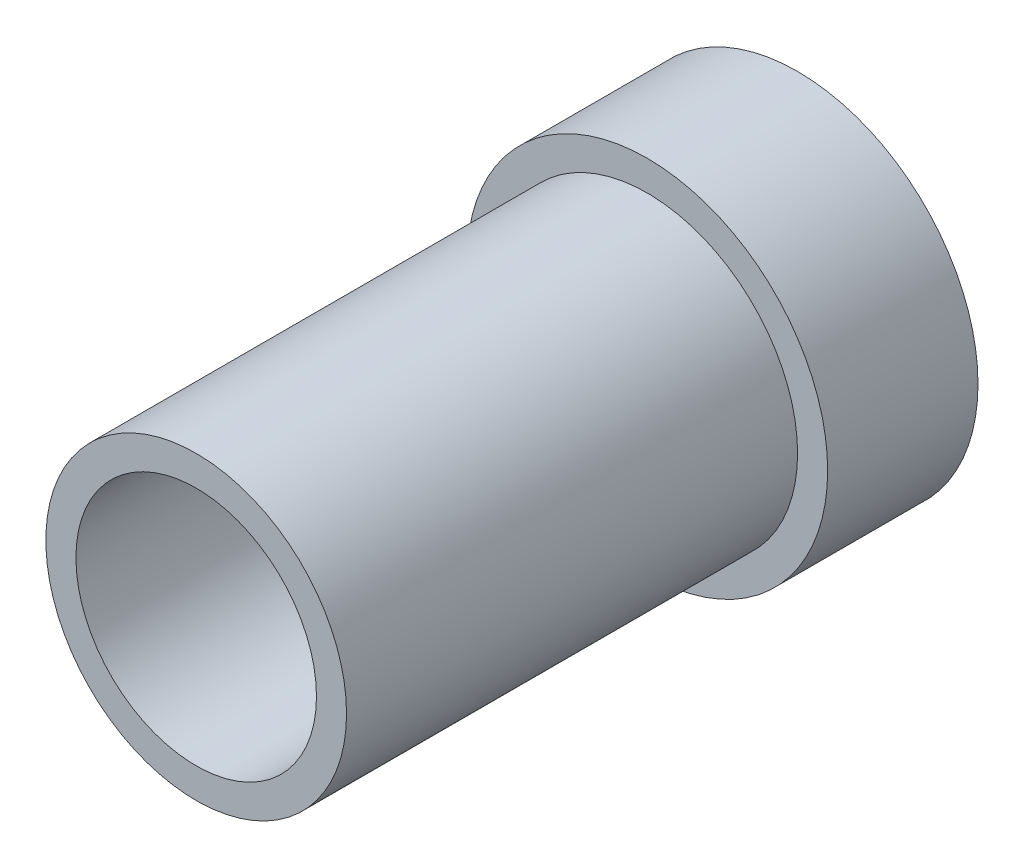
ISO-10303-21;
HEADER;
FILE_DESCRIPTION(('STEP AP214'),'2;1');
FILE_NAME('part.step','',(''),(''),'','','');
FILE_SCHEMA(('AUTOMOTIVE_DESIGN { 1 0 10303 214 1 1 1 1 }'));
ENDSEC;
DATA;
#1=APPLICATION_CONTEXT('core data for automotive mechanical design processes');
#2=APPLICATION_PROTOCOL_DEFINITION('international standard','automotive_design',2000,#1);
#3=PRODUCT_CONTEXT('',#1,'mechanical');
#4=PRODUCT('Part','Part','',(#3));
#5=PRODUCT_RELATED_PRODUCT_CATEGORY('part','',(#4));
#6=PRODUCT_DEFINITION_FORMATION('','',#4);
#7=PRODUCT_DEFINITION_CONTEXT('part definition',#1,'design');
#8=PRODUCT_DEFINITION('design','',#6,#7);
#9=PRODUCT_DEFINITION_SHAPE('','',#8);
#10=(LENGTH_UNIT() NAMED_UNIT(*) SI_UNIT(.MILLI.,.METRE.));
#11=(NAMED_UNIT(*) PLANE_ANGLE_UNIT() SI_UNIT($,.RADIAN.));
#12=(NAMED_UNIT(*) SI_UNIT($,.STERADIAN.) SOLID_ANGLE_UNIT());
#13=UNCERTAINTY_MEASURE_WITH_UNIT(LENGTH_MEASURE(1.E-05),#10,'distance_accuracy_value','');
#14=(GEOMETRIC_REPRESENTATION_CONTEXT(3) GLOBAL_UNCERTAINTY_ASSIGNED_CONTEXT((#13)) GLOBAL_UNIT_ASSIGNED_CONTEXT((#10,
#11,#12)) REPRESENTATION_CONTEXT('',''));
#15=CARTESIAN_POINT('',(0.,0.,0.));
#16=DIRECTION('',(0.,0.,1.));
#17=DIRECTION('',(1.,0.,0.));
#18=AXIS2_PLACEMENT_3D('',#15,#16,#17);
#19=CARTESIAN_POINT('',(0.,0.,3.));
#20=DIRECTION('',(0.,0.,-1.));
#21=DIRECTION('',(-1.,0.,0.));
#22=AXIS2_PLACEMENT_3D('',#19,#20,#21);
#23=CYLINDRICAL_SURFACE('',#22,0.8);
#24=CARTESIAN_POINT('',(0.,0.,3.));
#25=DIRECTION('',(0.,0.,1.));
#26=DIRECTION('',(1.,0.,0.));
#27=AXIS2_PLACEMENT_3D('',#24,#25,#26);
#28=CIRCLE('',#27,0.8);
#29=CARTESIAN_POINT('',(0.8,0.,3.));
#30=VERTEX_POINT('',#29);
#31=EDGE_CURVE('E52',#30,#30,#28,.T.);
#32=ORIENTED_EDGE('',*,*,#31,.T.);
#33=EDGE_LOOP('',(#32));
#34=FACE_BOUND('',#33,.T.);
#35=CARTESIAN_POINT('',(0.,0.,0.));
#36=DIRECTION('',(0.,0.,1.));
#37=DIRECTION('',(1.,0.,0.));
#38=AXIS2_PLACEMENT_3D('',#35,#36,#37);
#39=CIRCLE('',#38,0.8);
#40=CARTESIAN_POINT('',(0.8,0.,0.));
#41=VERTEX_POINT('',#40);
#42=EDGE_CURVE('E56',#41,#41,#39,.T.);
#43=ORIENTED_EDGE('',*,*,#42,.F.);
#44=EDGE_LOOP('',(#43));
#45=FACE_BOUND('',#44,.T.);
#46=ADVANCED_FACE('F44',(#34,#45),#23,.F.);
#47=CARTESIAN_POINT('',(0.,0.,3.));
#48=DIRECTION('',(0.,0.,-1.));
#49=DIRECTION('',(-1.,0.,0.));
#50=AXIS2_PLACEMENT_3D('',#47,#48,#49);
#51=CYLINDRICAL_SURFACE('',#50,1.);
#52=CARTESIAN_POINT('',(0.,0.,3.));
#53=DIRECTION('',(0.,0.,1.));
#54=DIRECTION('',(1.,0.,0.));
#55=AXIS2_PLACEMENT_3D('',#52,#53,#54);
#56=CIRCLE('',#55,1.);
#57=CARTESIAN_POINT('',(1.,0.,3.));
#58=VERTEX_POINT('',#57);
#59=EDGE_CURVE('E10',#58,#58,#56,.T.);
#60=ORIENTED_EDGE('',*,*,#59,.F.);
#61=EDGE_LOOP('',(#60));
#62=FACE_BOUND('',#61,.T.);
#63=CARTESIAN_POINT('',(0.,0.,0.));
#64=DIRECTION('',(0.,0.,1.));
#65=DIRECTION('',(1.,0.,0.));
#66=AXIS2_PLACEMENT_3D('',#63,#64,#65);
#67=CIRCLE('',#66,1.);
#68=CARTESIAN_POINT('',(1.,0.,0.));
#69=VERTEX_POINT('',#68);
#70=EDGE_CURVE('E48',#69,#69,#67,.T.);
#71=ORIENTED_EDGE('',*,*,#70,.T.);
#72=EDGE_LOOP('',(#71));
#73=FACE_BOUND('',#72,.T.);
#74=ADVANCED_FACE('F100',(#62,#73),#51,.T.);
#75=CARTESIAN_POINT('',(0.,0.,3.));
#76=DIRECTION('',(0.,0.,1.));
#77=DIRECTION('',(1.,0.,0.));
#78=AXIS2_PLACEMENT_3D('',#75,#76,#77);
#79=PLANE('',#78);
#80=ORIENTED_EDGE('',*,*,#31,.F.);
#81=EDGE_LOOP('',(#80));
#82=FACE_BOUND('',#81,.T.);
#83=ORIENTED_EDGE('',*,*,#59,.T.);
#84=EDGE_LOOP('',(#83));
#85=FACE_BOUND('',#84,.T.);
#86=ADVANCED_FACE('F105',(#82,#85),#79,.T.);
#87=CARTESIAN_POINT('',(0.,0.,0.));
#88=DIRECTION('',(0.,0.,1.));
#89=DIRECTION('',(1.,0.,0.));
#90=AXIS2_PLACEMENT_3D('',#87,#88,#89);
#91=PLANE('',#90);
#92=ORIENTED_EDGE('',*,*,#70,.F.);
#93=EDGE_LOOP('',(#92));
#94=FACE_BOUND('',#93,.T.);
#95=CARTESIAN_POINT('',(0.,0.,0.));
#96=DIRECTION('',(0.,0.,1.));
#97=DIRECTION('',(1.,0.,0.));
#98=AXIS2_PLACEMENT_3D('',#95,#96,#97);
#99=CIRCLE('',#98,1.2);
#100=CARTESIAN_POINT('',(1.2,0.,0.));
#101=VERTEX_POINT('',#100);
#102=EDGE_CURVE('E71',#101,#101,#99,.T.);
#103=ORIENTED_EDGE('',*,*,#102,.T.);
#104=EDGE_LOOP('',(#103));
#105=FACE_BOUND('',#104,.T.);
#106=ADVANCED_FACE('F83',(#94,#105),#91,.T.);
#107=CARTESIAN_POINT('',(0.,0.,-1.));
#108=DIRECTION('',(0.,0.,1.));
#109=DIRECTION('',(1.,0.,0.));
#110=AXIS2_PLACEMENT_3D('',#107,#108,#109);
#111=PLANE('',#110);
#112=CARTESIAN_POINT('',(0.,0.,-1.));
#113=DIRECTION('',(0.,0.,1.));
#114=DIRECTION('',(1.,0.,0.));
#115=AXIS2_PLACEMENT_3D('',#112,#113,#114);
#116=CIRCLE('',#115,1.2);
#117=CARTESIAN_POINT('',(1.2,0.,-1.));
#118=VERTEX_POINT('',#117);
#119=EDGE_CURVE('E66',#118,#118,#116,.T.);
#120=ORIENTED_EDGE('',*,*,#119,.F.);
#121=EDGE_LOOP('',(#120));
#122=FACE_BOUND('',#121,.T.);
#123=ADVANCED_FACE('F86',(#122),#111,.F.);
#124=CARTESIAN_POINT('',(0.,0.,-1.));
#125=DIRECTION('',(0.,0.,1.));
#126=DIRECTION('',(1.,0.,0.));
#127=AXIS2_PLACEMENT_3D('',#124,#125,#126);
#128=CYLINDRICAL_SURFACE('',#127,1.2);
#129=ORIENTED_EDGE('',*,*,#119,.T.);
#130=EDGE_LOOP('',(#129));
#131=FACE_BOUND('',#130,.T.);
#132=ORIENTED_EDGE('',*,*,#102,.F.);
#133=EDGE_LOOP('',(#132));
#134=FACE_BOUND('',#133,.T.);
#135=ADVANCED_FACE('F81',(#131,#134),#128,.T.);
#136=ORIENTED_EDGE('',*,*,#42,.T.);
#137=EDGE_LOOP('',(#136));
#138=FACE_BOUND('',#137,.T.);
#139=ADVANCED_FACE('F82',(#138),#91,.T.);
#140=CLOSED_SHELL('',(#46,#74,#86,#106,#123,#135,#139));
#141=MANIFOLD_SOLID_BREP('B2',#140);
#142=ADVANCED_BREP_SHAPE_REPRESENTATION('',(#18,#141),#14);
#143=SHAPE_DEFINITION_REPRESENTATION(#9,#142);
ENDSEC;
END-ISO-10303-21;
